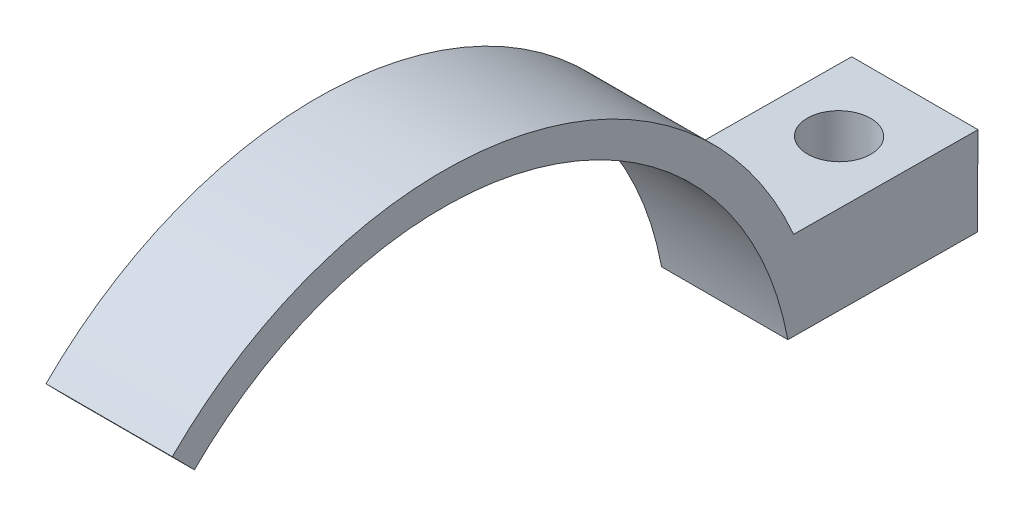
ISO-10303-21;
HEADER;
FILE_DESCRIPTION(('STEP AP214'),'2;1');
FILE_NAME('part.step','',(''),(''),'','','');
FILE_SCHEMA(('AUTOMOTIVE_DESIGN { 1 0 10303 214 1 1 1 1 }'));
ENDSEC;
DATA;
#1=APPLICATION_CONTEXT('core data for automotive mechanical design processes');
#2=APPLICATION_PROTOCOL_DEFINITION('international standard','automotive_design',2000,#1);
#3=PRODUCT_CONTEXT('',#1,'mechanical');
#4=PRODUCT('Part','Part','',(#3));
#5=PRODUCT_RELATED_PRODUCT_CATEGORY('part','',(#4));
#6=PRODUCT_DEFINITION_FORMATION('','',#4);
#7=PRODUCT_DEFINITION_CONTEXT('part definition',#1,'design');
#8=PRODUCT_DEFINITION('design','',#6,#7);
#9=PRODUCT_DEFINITION_SHAPE('','',#8);
#10=(LENGTH_UNIT() NAMED_UNIT(*) SI_UNIT(.MILLI.,.METRE.));
#11=(NAMED_UNIT(*) PLANE_ANGLE_UNIT() SI_UNIT($,.RADIAN.));
#12=(NAMED_UNIT(*) SI_UNIT($,.STERADIAN.) SOLID_ANGLE_UNIT());
#13=UNCERTAINTY_MEASURE_WITH_UNIT(LENGTH_MEASURE(1.E-05),#10,'distance_accuracy_value','');
#14=(GEOMETRIC_REPRESENTATION_CONTEXT(3) GLOBAL_UNCERTAINTY_ASSIGNED_CONTEXT((#13)) GLOBAL_UNIT_ASSIGNED_CONTEXT((#10,
#11,#12)) REPRESENTATION_CONTEXT('',''));
#15=CARTESIAN_POINT('',(0.,0.,0.));
#16=DIRECTION('',(0.,0.,1.));
#17=DIRECTION('',(1.,0.,0.));
#18=AXIS2_PLACEMENT_3D('',#15,#16,#17);
#19=CARTESIAN_POINT('',(5.,0.,0.));
#20=DIRECTION('',(-1.,0.,0.));
#21=DIRECTION('',(0.,0.,1.));
#22=AXIS2_PLACEMENT_3D('',#19,#20,#21);
#23=CYLINDRICAL_SURFACE('',#22,30.2875);
#24=DIRECTION('',(-1.,0.,0.));
#25=VECTOR('',#24,1.);
#26=CARTESIAN_POINT('',(5.,12.0642104381558,-27.7810633841452));
#27=LINE('',#26,#25);
#28=CARTESIAN_POINT('',(-5.,12.0642104381558,-27.7810633841452));
#29=VERTEX_POINT('',#28);
#30=CARTESIAN_POINT('',(5.,12.0642104381558,-27.7810633841452));
#31=VERTEX_POINT('',#30);
#32=EDGE_CURVE('E64',#29,#31,#27,.F.);
#33=ORIENTED_EDGE('',*,*,#32,.F.);
#34=CARTESIAN_POINT('',(-5.,0.,0.));
#35=DIRECTION('',(1.,0.,0.));
#36=DIRECTION('',(0.,0.,-1.));
#37=AXIS2_PLACEMENT_3D('',#34,#35,#36);
#38=CIRCLE('',#37,30.2875);
#39=CARTESIAN_POINT('',(-5.,21.416496635187,21.4164966351881));
#40=VERTEX_POINT('',#39);
#41=EDGE_CURVE('E103',#29,#40,#38,.T.);
#42=ORIENTED_EDGE('',*,*,#41,.T.);
#43=DIRECTION('',(-1.,0.,0.));
#44=VECTOR('',#43,1.);
#45=CARTESIAN_POINT('',(5.,21.416496635187,21.4164966351881));
#46=LINE('',#45,#44);
#47=CARTESIAN_POINT('',(5.,21.416496635187,21.4164966351881));
#48=VERTEX_POINT('',#47);
#49=EDGE_CURVE('E11',#48,#40,#46,.T.);
#50=ORIENTED_EDGE('',*,*,#49,.F.);
#51=CARTESIAN_POINT('',(5.,0.,0.));
#52=DIRECTION('',(1.,0.,0.));
#53=DIRECTION('',(0.,0.,-1.));
#54=AXIS2_PLACEMENT_3D('',#51,#52,#53);
#55=CIRCLE('',#54,30.2875);
#56=EDGE_CURVE('E60',#31,#48,#55,.T.);
#57=ORIENTED_EDGE('',*,*,#56,.F.);
#58=EDGE_LOOP('',(#33,#42,#50,#57));
#59=FACE_BOUND('',#58,.T.);
#60=ADVANCED_FACE('F45',(#59),#23,.T.);
#61=CARTESIAN_POINT('',(5.,19.6341205055652,19.6634693208738));
#62=DIRECTION('',(0.,0.701212640491293,-0.71295219532254));
#63=DIRECTION('',(0.,0.71295219532254,0.701212640491293));
#64=AXIS2_PLACEMENT_3D('',#61,#62,#63);
#65=PLANE('',#64);
#66=DIRECTION('',(0.,-0.71295219532254,-0.701212640491293));
#67=VECTOR('',#66,1.);
#68=CARTESIAN_POINT('',(-5.,19.6341205055652,19.6634693208738));
#69=LINE('',#68,#67);
#70=CARTESIAN_POINT('',(-5.,19.6341205055652,19.6634693208738));
#71=VERTEX_POINT('',#70);
#72=EDGE_CURVE('E150',#40,#71,#69,.T.);
#73=ORIENTED_EDGE('',*,*,#72,.T.);
#74=DIRECTION('',(-1.,0.,0.));
#75=VECTOR('',#74,1.);
#76=CARTESIAN_POINT('',(5.,19.6341205055652,19.6634693208738));
#77=LINE('',#76,#75);
#78=CARTESIAN_POINT('',(5.,19.6341205055652,19.6634693208738));
#79=VERTEX_POINT('',#78);
#80=EDGE_CURVE('E53',#79,#71,#77,.T.);
#81=ORIENTED_EDGE('',*,*,#80,.F.);
#82=DIRECTION('',(0.,-0.71295219532254,-0.701212640491293));
#83=VECTOR('',#82,1.);
#84=CARTESIAN_POINT('',(5.,19.6341205055652,19.6634693208738));
#85=LINE('',#84,#83);
#86=EDGE_CURVE('E137',#48,#79,#85,.T.);
#87=ORIENTED_EDGE('',*,*,#86,.F.);
#88=ORIENTED_EDGE('',*,*,#49,.T.);
#89=EDGE_LOOP('',(#73,#81,#87,#88));
#90=FACE_BOUND('',#89,.T.);
#91=ADVANCED_FACE('F176',(#90),#65,.F.);
#92=CARTESIAN_POINT('',(5.,0.,0.));
#93=DIRECTION('',(-1.,0.,0.));
#94=DIRECTION('',(0.,0.,1.));
#95=AXIS2_PLACEMENT_3D('',#92,#93,#94);
#96=CYLINDRICAL_SURFACE('',#95,27.7876);
#97=CARTESIAN_POINT('',(-5.,0.,0.));
#98=DIRECTION('',(-1.,0.,0.));
#99=DIRECTION('',(0.,0.,-1.));
#100=AXIS2_PLACEMENT_3D('',#97,#98,#99);
#101=CIRCLE('',#100,27.7876);
#102=CARTESIAN_POINT('',(-5.,5.06778367183601,-27.3215717413086));
#103=VERTEX_POINT('',#102);
#104=EDGE_CURVE('E153',#71,#103,#101,.T.);
#105=ORIENTED_EDGE('',*,*,#104,.T.);
#106=DIRECTION('',(-1.,0.,0.));
#107=VECTOR('',#106,1.);
#108=CARTESIAN_POINT('',(5.,5.06778367183601,-27.3215717413086));
#109=LINE('',#108,#107);
#110=CARTESIAN_POINT('',(5.,5.06778367183601,-27.3215717413086));
#111=VERTEX_POINT('',#110);
#112=EDGE_CURVE('E147',#111,#103,#109,.T.);
#113=ORIENTED_EDGE('',*,*,#112,.F.);
#114=CARTESIAN_POINT('',(5.,0.,0.));
#115=DIRECTION('',(-1.,0.,0.));
#116=DIRECTION('',(0.,0.,-1.));
#117=AXIS2_PLACEMENT_3D('',#114,#115,#116);
#118=CIRCLE('',#117,27.7876);
#119=EDGE_CURVE('E141',#79,#111,#118,.T.);
#120=ORIENTED_EDGE('',*,*,#119,.F.);
#121=ORIENTED_EDGE('',*,*,#80,.T.);
#122=EDGE_LOOP('',(#105,#113,#120,#121));
#123=FACE_BOUND('',#122,.T.);
#124=ADVANCED_FACE('F166',(#123),#96,.F.);
#125=CARTESIAN_POINT('',(5.,5.06778367183601,-27.3215717413086));
#126=DIRECTION('',(0.,0.999965545119522,-0.00830111882928539));
#127=DIRECTION('',(0.,0.00830111882928539,0.999965545119522));
#128=AXIS2_PLACEMENT_3D('',#125,#126,#127);
#129=PLANE('',#128);
#130=DIRECTION('',(0.,-0.00830111882928539,-0.999965545119522));
#131=VECTOR('',#130,1.);
#132=CARTESIAN_POINT('',(-5.,5.06778367183601,-27.3215717413086));
#133=LINE('',#132,#131);
#134=CARTESIAN_POINT('',(-5.,4.94326688939673,-42.3210549181014));
#135=VERTEX_POINT('',#134);
#136=EDGE_CURVE('E138',#103,#135,#133,.T.);
#137=ORIENTED_EDGE('',*,*,#136,.T.);
#138=DIRECTION('',(1.,0.,0.));
#139=VECTOR('',#138,1.);
#140=CARTESIAN_POINT('',(-5.,4.94326688939673,-42.3210549181014));
#141=LINE('',#140,#139);
#142=CARTESIAN_POINT('',(5.,4.94326688939673,-42.3210549181014));
#143=VERTEX_POINT('',#142);
#144=EDGE_CURVE('E108',#135,#143,#141,.T.);
#145=ORIENTED_EDGE('',*,*,#144,.T.);
#146=DIRECTION('',(0.,-0.00830111882928539,-0.999965545119522));
#147=VECTOR('',#146,1.);
#148=CARTESIAN_POINT('',(5.,5.06778367183601,-27.3215717413086));
#149=LINE('',#148,#147);
#150=EDGE_CURVE('E144',#111,#143,#149,.T.);
#151=ORIENTED_EDGE('',*,*,#150,.F.);
#152=ORIENTED_EDGE('',*,*,#112,.T.);
#153=EDGE_LOOP('',(#137,#145,#151,#152));
#154=FACE_BOUND('',#153,.T.);
#155=CARTESIAN_POINT('',(0.,4.99307360237244,-36.3212616473843));
#156=DIRECTION('',(0.,-0.999965545119522,0.00830111882928539));
#157=DIRECTION('',(0.,-0.00830111882928539,-0.999965545119522));
#158=AXIS2_PLACEMENT_3D('',#155,#156,#157);
#159=CIRCLE('',#158,2.5);
#160=CARTESIAN_POINT('',(0.,4.97232080529923,-38.8211755101831));
#161=VERTEX_POINT('',#160);
#162=EDGE_CURVE('E207',#161,#161,#159,.T.);
#163=ORIENTED_EDGE('',*,*,#162,.F.);
#164=EDGE_LOOP('',(#163));
#165=FACE_BOUND('',#164,.T.);
#166=ADVANCED_FACE('F171',(#154,#165),#129,.F.);
#167=CARTESIAN_POINT('',(5.,0.,0.));
#168=DIRECTION('',(1.,0.,0.));
#169=DIRECTION('',(0.,0.,-1.));
#170=AXIS2_PLACEMENT_3D('',#167,#168,#169);
#171=PLANE('',#170);
#172=ORIENTED_EDGE('',*,*,#119,.T.);
#173=ORIENTED_EDGE('',*,*,#150,.T.);
#174=DIRECTION('',(0.,-0.999965545119522,0.00830111882928539));
#175=VECTOR('',#174,1.);
#176=CARTESIAN_POINT('',(5.,11.9430257052334,-42.3791627499064));
#177=LINE('',#176,#175);
#178=CARTESIAN_POINT('',(5.,11.9430257052334,-42.3791627499064));
#179=VERTEX_POINT('',#178);
#180=EDGE_CURVE('E116',#179,#143,#177,.T.);
#181=ORIENTED_EDGE('',*,*,#180,.F.);
#182=DIRECTION('',(0.,0.00830111882928538,0.999965545119522));
#183=VECTOR('',#182,1.);
#184=CARTESIAN_POINT('',(5.,12.0675424876727,-27.3796795731136));
#185=LINE('',#184,#183);
#186=EDGE_CURVE('E117',#179,#31,#185,.T.);
#187=ORIENTED_EDGE('',*,*,#186,.T.);
#188=ORIENTED_EDGE('',*,*,#56,.T.);
#189=ORIENTED_EDGE('',*,*,#86,.T.);
#190=EDGE_LOOP('',(#172,#173,#181,#187,#188,#189));
#191=FACE_BOUND('',#190,.T.);
#192=ADVANCED_FACE('F175',(#191),#171,.T.);
#193=CARTESIAN_POINT('',(-5.,0.,0.));
#194=DIRECTION('',(1.,0.,0.));
#195=DIRECTION('',(0.,0.,-1.));
#196=AXIS2_PLACEMENT_3D('',#193,#194,#195);
#197=PLANE('',#196);
#198=ORIENTED_EDGE('',*,*,#136,.F.);
#199=ORIENTED_EDGE('',*,*,#104,.F.);
#200=ORIENTED_EDGE('',*,*,#72,.F.);
#201=ORIENTED_EDGE('',*,*,#41,.F.);
#202=DIRECTION('',(0.,-0.00830111882928538,-0.999965545119522));
#203=VECTOR('',#202,1.);
#204=CARTESIAN_POINT('',(-5.,12.0675424876727,-27.3796795731136));
#205=LINE('',#204,#203);
#206=CARTESIAN_POINT('',(-5.,11.9430257052334,-42.3791627499064));
#207=VERTEX_POINT('',#206);
#208=EDGE_CURVE('E96',#29,#207,#205,.T.);
#209=ORIENTED_EDGE('',*,*,#208,.T.);
#210=DIRECTION('',(0.,-0.999965545119522,0.00830111882928539));
#211=VECTOR('',#210,1.);
#212=CARTESIAN_POINT('',(-5.,11.9430257052334,-42.3791627499064));
#213=LINE('',#212,#211);
#214=EDGE_CURVE('E100',#207,#135,#213,.T.);
#215=ORIENTED_EDGE('',*,*,#214,.T.);
#216=EDGE_LOOP('',(#198,#199,#200,#201,#209,#215));
#217=FACE_BOUND('',#216,.T.);
#218=ADVANCED_FACE('F99',(#217),#197,.F.);
#219=CARTESIAN_POINT('',(0.,12.2939850732013,-0.10205734735181));
#220=DIRECTION('',(0.,-0.999965545119522,0.00830111882928538));
#221=DIRECTION('',(0.,-0.00830111882928538,-0.999965545119522));
#222=AXIS2_PLACEMENT_3D('',#219,#220,#221);
#223=PLANE('',#222);
#224=CARTESIAN_POINT('',(0.,11.9928324182091,-36.3793694791893));
#225=DIRECTION('',(0.,-0.999965545119522,0.00830111882928539));
#226=DIRECTION('',(0.,-0.00830111882928539,-0.999965545119522));
#227=AXIS2_PLACEMENT_3D('',#224,#225,#226);
#228=CIRCLE('',#227,2.5);
#229=CARTESIAN_POINT('',(0.,11.9720796211359,-38.8792833419881));
#230=VERTEX_POINT('',#229);
#231=EDGE_CURVE('E130',#230,#230,#228,.T.);
#232=ORIENTED_EDGE('',*,*,#231,.T.);
#233=EDGE_LOOP('',(#232));
#234=FACE_BOUND('',#233,.T.);
#235=ORIENTED_EDGE('',*,*,#208,.F.);
#236=ORIENTED_EDGE('',*,*,#32,.T.);
#237=ORIENTED_EDGE('',*,*,#186,.F.);
#238=DIRECTION('',(1.,0.,0.));
#239=VECTOR('',#238,1.);
#240=CARTESIAN_POINT('',(-5.,11.9430257052334,-42.3791627499064));
#241=LINE('',#240,#239);
#242=EDGE_CURVE('E107',#207,#179,#241,.T.);
#243=ORIENTED_EDGE('',*,*,#242,.F.);
#244=EDGE_LOOP('',(#235,#236,#237,#243));
#245=FACE_BOUND('',#244,.T.);
#246=ADVANCED_FACE('F120',(#234,#245),#223,.F.);
#247=CARTESIAN_POINT('',(-5.,11.9430257052334,-42.3791627499064));
#248=DIRECTION('',(0.,-0.00830111882928539,-0.999965545119522));
#249=DIRECTION('',(0.,0.999965545119522,-0.00830111882928539));
#250=AXIS2_PLACEMENT_3D('',#247,#248,#249);
#251=PLANE('',#250);
#252=ORIENTED_EDGE('',*,*,#144,.F.);
#253=ORIENTED_EDGE('',*,*,#214,.F.);
#254=ORIENTED_EDGE('',*,*,#242,.T.);
#255=ORIENTED_EDGE('',*,*,#180,.T.);
#256=EDGE_LOOP('',(#252,#253,#254,#255));
#257=FACE_BOUND('',#256,.T.);
#258=ADVANCED_FACE('F112',(#257),#251,.T.);
#259=CARTESIAN_POINT('',(0.,11.9928324182091,-36.3793694791893));
#260=DIRECTION('',(0.,-0.999965545119522,0.00830111882928539));
#261=DIRECTION('',(0.,-0.00830111882928539,-0.999965545119522));
#262=AXIS2_PLACEMENT_3D('',#259,#260,#261);
#263=CYLINDRICAL_SURFACE('',#262,2.5);
#264=ORIENTED_EDGE('',*,*,#231,.F.);
#265=EDGE_LOOP('',(#264));
#266=FACE_BOUND('',#265,.T.);
#267=ORIENTED_EDGE('',*,*,#162,.T.);
#268=EDGE_LOOP('',(#267));
#269=FACE_BOUND('',#268,.T.);
#270=ADVANCED_FACE('F194',(#266,#269),#263,.F.);
#271=CLOSED_SHELL('',(#60,#91,#124,#166,#192,#218,#246,#258,#270));
#272=MANIFOLD_SOLID_BREP('B2',#271);
#273=ADVANCED_BREP_SHAPE_REPRESENTATION('',(#18,#272),#14);
#274=SHAPE_DEFINITION_REPRESENTATION(#9,#273);
ENDSEC;
END-ISO-10303-21;
